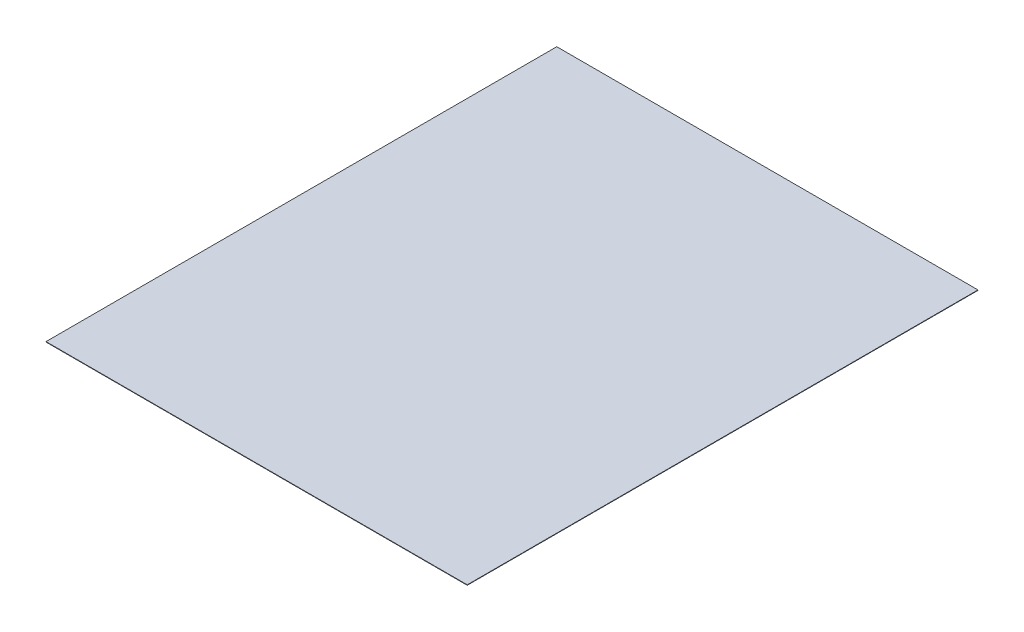
ISO-10303-21;
HEADER;
FILE_DESCRIPTION(('STEP AP214'),'2;1');
FILE_NAME('part.step','',(''),(''),'','','');
FILE_SCHEMA(('AUTOMOTIVE_DESIGN { 1 0 10303 214 1 1 1 1 }'));
ENDSEC;
DATA;
#1=APPLICATION_CONTEXT('core data for automotive mechanical design processes');
#2=APPLICATION_PROTOCOL_DEFINITION('international standard','automotive_design',2000,#1);
#3=PRODUCT_CONTEXT('',#1,'mechanical');
#4=PRODUCT('Part','Part','',(#3));
#5=PRODUCT_RELATED_PRODUCT_CATEGORY('part','',(#4));
#6=PRODUCT_DEFINITION_FORMATION('','',#4);
#7=PRODUCT_DEFINITION_CONTEXT('part definition',#1,'design');
#8=PRODUCT_DEFINITION('design','',#6,#7);
#9=PRODUCT_DEFINITION_SHAPE('','',#8);
#10=(LENGTH_UNIT() NAMED_UNIT(*) SI_UNIT(.MILLI.,.METRE.));
#11=(NAMED_UNIT(*) PLANE_ANGLE_UNIT() SI_UNIT($,.RADIAN.));
#12=(NAMED_UNIT(*) SI_UNIT($,.STERADIAN.) SOLID_ANGLE_UNIT());
#13=UNCERTAINTY_MEASURE_WITH_UNIT(LENGTH_MEASURE(1.E-05),#10,'distance_accuracy_value','');
#14=(GEOMETRIC_REPRESENTATION_CONTEXT(3) GLOBAL_UNCERTAINTY_ASSIGNED_CONTEXT((#13)) GLOBAL_UNIT_ASSIGNED_CONTEXT((#10,
#11,#12)) REPRESENTATION_CONTEXT('',''));
#15=CARTESIAN_POINT('',(0.,0.,0.));
#16=DIRECTION('',(0.,0.,1.));
#17=DIRECTION('',(1.,0.,0.));
#18=AXIS2_PLACEMENT_3D('',#15,#16,#17);
#19=CARTESIAN_POINT('',(-500.,1.,-606.25));
#20=DIRECTION('',(1.,0.,0.));
#21=DIRECTION('',(0.,0.,-1.));
#22=AXIS2_PLACEMENT_3D('',#19,#20,#21);
#23=PLANE('',#22);
#24=DIRECTION('',(0.,0.,1.));
#25=VECTOR('',#24,1.);
#26=CARTESIAN_POINT('',(-500.,0.,-606.25));
#27=LINE('',#26,#25);
#28=CARTESIAN_POINT('',(-500.,0.,-606.25));
#29=VERTEX_POINT('',#28);
#30=CARTESIAN_POINT('',(-500.,0.,606.25));
#31=VERTEX_POINT('',#30);
#32=EDGE_CURVE('E113',#29,#31,#27,.T.);
#33=ORIENTED_EDGE('',*,*,#32,.T.);
#34=DIRECTION('',(0.,-1.,0.));
#35=VECTOR('',#34,1.);
#36=CARTESIAN_POINT('',(-500.,1.,606.25));
#37=LINE('',#36,#35);
#38=CARTESIAN_POINT('',(-500.,1.,606.25));
#39=VERTEX_POINT('',#38);
#40=EDGE_CURVE('E11',#39,#31,#37,.T.);
#41=ORIENTED_EDGE('',*,*,#40,.F.);
#42=DIRECTION('',(0.,0.,1.));
#43=VECTOR('',#42,1.);
#44=CARTESIAN_POINT('',(-500.,1.,-606.25));
#45=LINE('',#44,#43);
#46=CARTESIAN_POINT('',(-500.,1.,-606.25));
#47=VERTEX_POINT('',#46);
#48=EDGE_CURVE('E97',#47,#39,#45,.T.);
#49=ORIENTED_EDGE('',*,*,#48,.F.);
#50=DIRECTION('',(0.,-1.,0.));
#51=VECTOR('',#50,1.);
#52=CARTESIAN_POINT('',(-500.,1.,-606.25));
#53=LINE('',#52,#51);
#54=EDGE_CURVE('E109',#47,#29,#53,.T.);
#55=ORIENTED_EDGE('',*,*,#54,.T.);
#56=EDGE_LOOP('',(#33,#41,#49,#55));
#57=FACE_BOUND('',#56,.T.);
#58=ADVANCED_FACE('F45',(#57),#23,.F.);
#59=CARTESIAN_POINT('',(500.,1.,606.25));
#60=DIRECTION('',(0.,0.,-1.));
#61=DIRECTION('',(-1.,0.,0.));
#62=AXIS2_PLACEMENT_3D('',#59,#60,#61);
#63=PLANE('',#62);
#64=DIRECTION('',(1.,0.,0.));
#65=VECTOR('',#64,1.);
#66=CARTESIAN_POINT('',(500.,0.,606.25));
#67=LINE('',#66,#65);
#68=CARTESIAN_POINT('',(500.,0.,606.25));
#69=VERTEX_POINT('',#68);
#70=EDGE_CURVE('E102',#31,#69,#67,.T.);
#71=ORIENTED_EDGE('',*,*,#70,.T.);
#72=DIRECTION('',(0.,-1.,0.));
#73=VECTOR('',#72,1.);
#74=CARTESIAN_POINT('',(500.,1.,606.25));
#75=LINE('',#74,#73);
#76=CARTESIAN_POINT('',(500.,1.,606.25));
#77=VERTEX_POINT('',#76);
#78=EDGE_CURVE('E54',#77,#69,#75,.T.);
#79=ORIENTED_EDGE('',*,*,#78,.F.);
#80=DIRECTION('',(1.,0.,0.));
#81=VECTOR('',#80,1.);
#82=CARTESIAN_POINT('',(500.,1.,606.25));
#83=LINE('',#82,#81);
#84=EDGE_CURVE('E92',#39,#77,#83,.T.);
#85=ORIENTED_EDGE('',*,*,#84,.F.);
#86=ORIENTED_EDGE('',*,*,#40,.T.);
#87=EDGE_LOOP('',(#71,#79,#85,#86));
#88=FACE_BOUND('',#87,.T.);
#89=ADVANCED_FACE('F101',(#88),#63,.F.);
#90=CARTESIAN_POINT('',(500.,1.,-606.25));
#91=DIRECTION('',(-1.,0.,0.));
#92=DIRECTION('',(0.,0.,1.));
#93=AXIS2_PLACEMENT_3D('',#90,#91,#92);
#94=PLANE('',#93);
#95=DIRECTION('',(0.,0.,-1.));
#96=VECTOR('',#95,1.);
#97=CARTESIAN_POINT('',(500.,0.,-606.25));
#98=LINE('',#97,#96);
#99=CARTESIAN_POINT('',(500.,0.,-606.25));
#100=VERTEX_POINT('',#99);
#101=EDGE_CURVE('E79',#69,#100,#98,.T.);
#102=ORIENTED_EDGE('',*,*,#101,.T.);
#103=DIRECTION('',(0.,-1.,0.));
#104=VECTOR('',#103,1.);
#105=CARTESIAN_POINT('',(500.,1.,-606.25));
#106=LINE('',#105,#104);
#107=CARTESIAN_POINT('',(500.,1.,-606.25));
#108=VERTEX_POINT('',#107);
#109=EDGE_CURVE('E104',#108,#100,#106,.T.);
#110=ORIENTED_EDGE('',*,*,#109,.F.);
#111=DIRECTION('',(0.,0.,-1.));
#112=VECTOR('',#111,1.);
#113=CARTESIAN_POINT('',(500.,1.,-606.25));
#114=LINE('',#113,#112);
#115=EDGE_CURVE('E95',#77,#108,#114,.T.);
#116=ORIENTED_EDGE('',*,*,#115,.F.);
#117=ORIENTED_EDGE('',*,*,#78,.T.);
#118=EDGE_LOOP('',(#102,#110,#116,#117));
#119=FACE_BOUND('',#118,.T.);
#120=ADVANCED_FACE('F105',(#119),#94,.F.);
#121=CARTESIAN_POINT('',(500.,1.,-606.25));
#122=DIRECTION('',(0.,0.,1.));
#123=DIRECTION('',(1.,0.,0.));
#124=AXIS2_PLACEMENT_3D('',#121,#122,#123);
#125=PLANE('',#124);
#126=DIRECTION('',(-1.,0.,0.));
#127=VECTOR('',#126,1.);
#128=CARTESIAN_POINT('',(500.,0.,-606.25));
#129=LINE('',#128,#127);
#130=EDGE_CURVE('E85',#100,#29,#129,.T.);
#131=ORIENTED_EDGE('',*,*,#130,.T.);
#132=ORIENTED_EDGE('',*,*,#54,.F.);
#133=DIRECTION('',(-1.,0.,0.));
#134=VECTOR('',#133,1.);
#135=CARTESIAN_POINT('',(500.,1.,-606.25));
#136=LINE('',#135,#134);
#137=EDGE_CURVE('E62',#108,#47,#136,.T.);
#138=ORIENTED_EDGE('',*,*,#137,.F.);
#139=ORIENTED_EDGE('',*,*,#109,.T.);
#140=EDGE_LOOP('',(#131,#132,#138,#139));
#141=FACE_BOUND('',#140,.T.);
#142=ADVANCED_FACE('F126',(#141),#125,.F.);
#143=CARTESIAN_POINT('',(0.,1.,0.));
#144=DIRECTION('',(0.,-1.,0.));
#145=DIRECTION('',(0.,0.,-1.));
#146=AXIS2_PLACEMENT_3D('',#143,#144,#145);
#147=PLANE('',#146);
#148=ORIENTED_EDGE('',*,*,#48,.T.);
#149=ORIENTED_EDGE('',*,*,#84,.T.);
#150=ORIENTED_EDGE('',*,*,#115,.T.);
#151=ORIENTED_EDGE('',*,*,#137,.T.);
#152=EDGE_LOOP('',(#148,#149,#150,#151));
#153=FACE_BOUND('',#152,.T.);
#154=ADVANCED_FACE('F93',(#153),#147,.F.);
#155=CARTESIAN_POINT('',(0.,0.,0.));
#156=DIRECTION('',(0.,-1.,0.));
#157=DIRECTION('',(0.,0.,-1.));
#158=AXIS2_PLACEMENT_3D('',#155,#156,#157);
#159=PLANE('',#158);
#160=ORIENTED_EDGE('',*,*,#32,.F.);
#161=ORIENTED_EDGE('',*,*,#130,.F.);
#162=ORIENTED_EDGE('',*,*,#101,.F.);
#163=ORIENTED_EDGE('',*,*,#70,.F.);
#164=EDGE_LOOP('',(#160,#161,#162,#163));
#165=FACE_BOUND('',#164,.T.);
#166=ADVANCED_FACE('F129',(#165),#159,.T.);
#167=CLOSED_SHELL('',(#58,#89,#120,#142,#154,#166));
#168=MANIFOLD_SOLID_BREP('B2',#167);
#169=ADVANCED_BREP_SHAPE_REPRESENTATION('',(#18,#168),#14);
#170=SHAPE_DEFINITION_REPRESENTATION(#9,#169);
ENDSEC;
END-ISO-10303-21;
